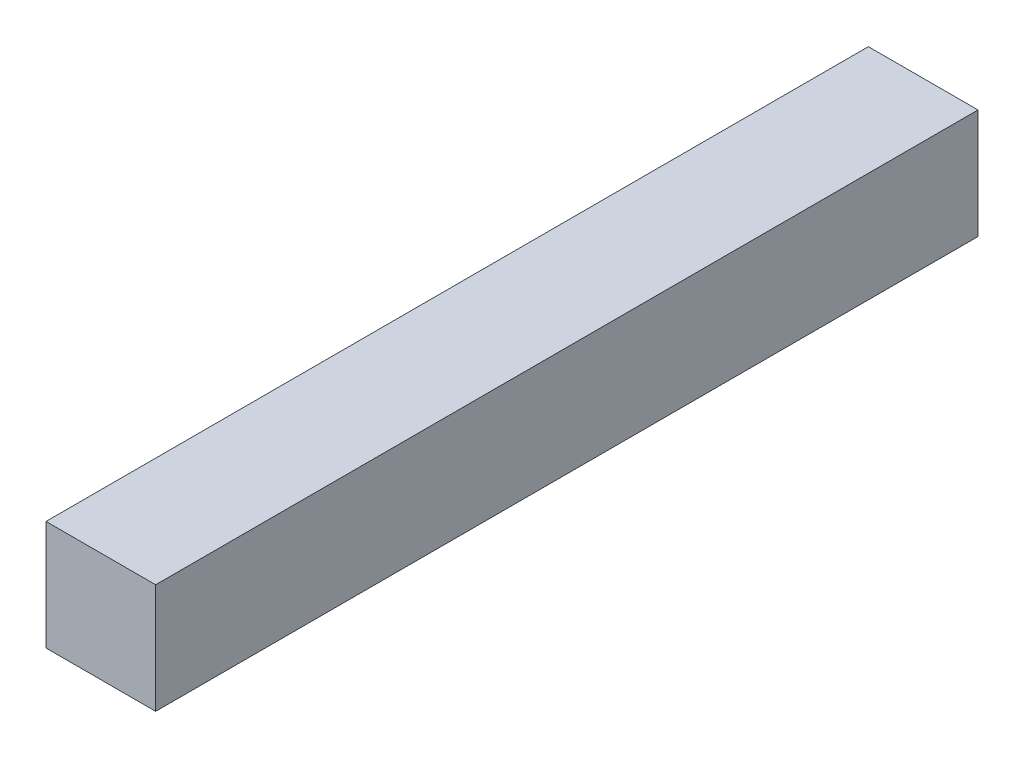
ISO-10303-21;
HEADER;
FILE_DESCRIPTION(('STEP AP214'),'2;1');
FILE_NAME('part.step','',(''),(''),'','','');
FILE_SCHEMA(('AUTOMOTIVE_DESIGN { 1 0 10303 214 1 1 1 1 }'));
ENDSEC;
DATA;
#1=APPLICATION_CONTEXT('core data for automotive mechanical design processes');
#2=APPLICATION_PROTOCOL_DEFINITION('international standard','automotive_design',2000,#1);
#3=PRODUCT_CONTEXT('',#1,'mechanical');
#4=PRODUCT('Part','Part','',(#3));
#5=PRODUCT_RELATED_PRODUCT_CATEGORY('part','',(#4));
#6=PRODUCT_DEFINITION_FORMATION('','',#4);
#7=PRODUCT_DEFINITION_CONTEXT('part definition',#1,'design');
#8=PRODUCT_DEFINITION('design','',#6,#7);
#9=PRODUCT_DEFINITION_SHAPE('','',#8);
#10=(LENGTH_UNIT() NAMED_UNIT(*) SI_UNIT(.MILLI.,.METRE.));
#11=(NAMED_UNIT(*) PLANE_ANGLE_UNIT() SI_UNIT($,.RADIAN.));
#12=(NAMED_UNIT(*) SI_UNIT($,.STERADIAN.) SOLID_ANGLE_UNIT());
#13=UNCERTAINTY_MEASURE_WITH_UNIT(LENGTH_MEASURE(1.E-05),#10,'distance_accuracy_value','');
#14=(GEOMETRIC_REPRESENTATION_CONTEXT(3) GLOBAL_UNCERTAINTY_ASSIGNED_CONTEXT((#13)) GLOBAL_UNIT_ASSIGNED_CONTEXT((#10,
#11,#12)) REPRESENTATION_CONTEXT('',''));
#15=CARTESIAN_POINT('',(0.,0.,0.));
#16=DIRECTION('',(0.,0.,1.));
#17=DIRECTION('',(1.,0.,0.));
#18=AXIS2_PLACEMENT_3D('',#15,#16,#17);
#19=CARTESIAN_POINT('',(25.,-25.,375.));
#20=DIRECTION('',(-1.,0.,0.));
#21=DIRECTION('',(0.,0.,1.));
#22=AXIS2_PLACEMENT_3D('',#19,#20,#21);
#23=PLANE('',#22);
#24=DIRECTION('',(0.,1.,0.));
#25=VECTOR('',#24,1.);
#26=CARTESIAN_POINT('',(25.,-25.,0.));
#27=LINE('',#26,#25);
#28=CARTESIAN_POINT('',(25.,-25.,0.));
#29=VERTEX_POINT('',#28);
#30=CARTESIAN_POINT('',(25.,25.,0.));
#31=VERTEX_POINT('',#30);
#32=EDGE_CURVE('E105',#29,#31,#27,.T.);
#33=ORIENTED_EDGE('',*,*,#32,.T.);
#34=DIRECTION('',(0.,0.,-1.));
#35=VECTOR('',#34,1.);
#36=CARTESIAN_POINT('',(25.,25.,375.));
#37=LINE('',#36,#35);
#38=CARTESIAN_POINT('',(25.,25.,375.));
#39=VERTEX_POINT('',#38);
#40=EDGE_CURVE('E11',#39,#31,#37,.T.);
#41=ORIENTED_EDGE('',*,*,#40,.F.);
#42=DIRECTION('',(0.,1.,0.));
#43=VECTOR('',#42,1.);
#44=CARTESIAN_POINT('',(25.,-25.,375.));
#45=LINE('',#44,#43);
#46=CARTESIAN_POINT('',(25.,-25.,375.));
#47=VERTEX_POINT('',#46);
#48=EDGE_CURVE('E89',#47,#39,#45,.T.);
#49=ORIENTED_EDGE('',*,*,#48,.F.);
#50=DIRECTION('',(0.,0.,-1.));
#51=VECTOR('',#50,1.);
#52=CARTESIAN_POINT('',(25.,-25.,375.));
#53=LINE('',#52,#51);
#54=EDGE_CURVE('E98',#47,#29,#53,.T.);
#55=ORIENTED_EDGE('',*,*,#54,.T.);
#56=EDGE_LOOP('',(#33,#41,#49,#55));
#57=FACE_BOUND('',#56,.T.);
#58=ADVANCED_FACE('F39',(#57),#23,.F.);
#59=CARTESIAN_POINT('',(-25.,25.,375.));
#60=DIRECTION('',(0.,-1.,0.));
#61=DIRECTION('',(0.,0.,-1.));
#62=AXIS2_PLACEMENT_3D('',#59,#60,#61);
#63=PLANE('',#62);
#64=DIRECTION('',(-1.,0.,0.));
#65=VECTOR('',#64,1.);
#66=CARTESIAN_POINT('',(-25.,25.,0.));
#67=LINE('',#66,#65);
#68=CARTESIAN_POINT('',(-25.,25.,0.));
#69=VERTEX_POINT('',#68);
#70=EDGE_CURVE('E94',#31,#69,#67,.T.);
#71=ORIENTED_EDGE('',*,*,#70,.T.);
#72=DIRECTION('',(0.,0.,-1.));
#73=VECTOR('',#72,1.);
#74=CARTESIAN_POINT('',(-25.,25.,375.));
#75=LINE('',#74,#73);
#76=CARTESIAN_POINT('',(-25.,25.,375.));
#77=VERTEX_POINT('',#76);
#78=EDGE_CURVE('E50',#77,#69,#75,.T.);
#79=ORIENTED_EDGE('',*,*,#78,.F.);
#80=DIRECTION('',(-1.,0.,0.));
#81=VECTOR('',#80,1.);
#82=CARTESIAN_POINT('',(-25.,25.,375.));
#83=LINE('',#82,#81);
#84=EDGE_CURVE('E83',#39,#77,#83,.T.);
#85=ORIENTED_EDGE('',*,*,#84,.F.);
#86=ORIENTED_EDGE('',*,*,#40,.T.);
#87=EDGE_LOOP('',(#71,#79,#85,#86));
#88=FACE_BOUND('',#87,.T.);
#89=ADVANCED_FACE('F91',(#88),#63,.F.);
#90=CARTESIAN_POINT('',(-25.,-25.,375.));
#91=DIRECTION('',(1.,0.,0.));
#92=DIRECTION('',(0.,0.,-1.));
#93=AXIS2_PLACEMENT_3D('',#90,#91,#92);
#94=PLANE('',#93);
#95=DIRECTION('',(0.,-1.,0.));
#96=VECTOR('',#95,1.);
#97=CARTESIAN_POINT('',(-25.,-25.,0.));
#98=LINE('',#97,#96);
#99=CARTESIAN_POINT('',(-25.,-25.,0.));
#100=VERTEX_POINT('',#99);
#101=EDGE_CURVE('E75',#69,#100,#98,.T.);
#102=ORIENTED_EDGE('',*,*,#101,.T.);
#103=DIRECTION('',(0.,0.,-1.));
#104=VECTOR('',#103,1.);
#105=CARTESIAN_POINT('',(-25.,-25.,375.));
#106=LINE('',#105,#104);
#107=CARTESIAN_POINT('',(-25.,-25.,375.));
#108=VERTEX_POINT('',#107);
#109=EDGE_CURVE('E92',#108,#100,#106,.T.);
#110=ORIENTED_EDGE('',*,*,#109,.F.);
#111=DIRECTION('',(0.,-1.,0.));
#112=VECTOR('',#111,1.);
#113=CARTESIAN_POINT('',(-25.,-25.,375.));
#114=LINE('',#113,#112);
#115=EDGE_CURVE('E86',#77,#108,#114,.T.);
#116=ORIENTED_EDGE('',*,*,#115,.F.);
#117=ORIENTED_EDGE('',*,*,#78,.T.);
#118=EDGE_LOOP('',(#102,#110,#116,#117));
#119=FACE_BOUND('',#118,.T.);
#120=ADVANCED_FACE('F96',(#119),#94,.F.);
#121=CARTESIAN_POINT('',(-25.,-25.,375.));
#122=DIRECTION('',(0.,1.,0.));
#123=DIRECTION('',(0.,0.,1.));
#124=AXIS2_PLACEMENT_3D('',#121,#122,#123);
#125=PLANE('',#124);
#126=DIRECTION('',(1.,0.,0.));
#127=VECTOR('',#126,1.);
#128=CARTESIAN_POINT('',(-25.,-25.,0.));
#129=LINE('',#128,#127);
#130=EDGE_CURVE('E77',#100,#29,#129,.T.);
#131=ORIENTED_EDGE('',*,*,#130,.T.);
#132=ORIENTED_EDGE('',*,*,#54,.F.);
#133=DIRECTION('',(1.,0.,0.));
#134=VECTOR('',#133,1.);
#135=CARTESIAN_POINT('',(-25.,-25.,375.));
#136=LINE('',#135,#134);
#137=EDGE_CURVE('E54',#108,#47,#136,.T.);
#138=ORIENTED_EDGE('',*,*,#137,.F.);
#139=ORIENTED_EDGE('',*,*,#109,.T.);
#140=EDGE_LOOP('',(#131,#132,#138,#139));
#141=FACE_BOUND('',#140,.T.);
#142=ADVANCED_FACE('F108',(#141),#125,.F.);
#143=CARTESIAN_POINT('',(0.,0.,375.));
#144=DIRECTION('',(0.,0.,-1.));
#145=DIRECTION('',(-1.,0.,0.));
#146=AXIS2_PLACEMENT_3D('',#143,#144,#145);
#147=PLANE('',#146);
#148=ORIENTED_EDGE('',*,*,#48,.T.);
#149=ORIENTED_EDGE('',*,*,#84,.T.);
#150=ORIENTED_EDGE('',*,*,#115,.T.);
#151=ORIENTED_EDGE('',*,*,#137,.T.);
#152=EDGE_LOOP('',(#148,#149,#150,#151));
#153=FACE_BOUND('',#152,.T.);
#154=ADVANCED_FACE('F88',(#153),#147,.F.);
#155=CARTESIAN_POINT('',(0.,0.,0.));
#156=DIRECTION('',(0.,0.,-1.));
#157=DIRECTION('',(-1.,0.,0.));
#158=AXIS2_PLACEMENT_3D('',#155,#156,#157);
#159=PLANE('',#158);
#160=ORIENTED_EDGE('',*,*,#32,.F.);
#161=ORIENTED_EDGE('',*,*,#130,.F.);
#162=ORIENTED_EDGE('',*,*,#101,.F.);
#163=ORIENTED_EDGE('',*,*,#70,.F.);
#164=EDGE_LOOP('',(#160,#161,#162,#163));
#165=FACE_BOUND('',#164,.T.);
#166=ADVANCED_FACE('F115',(#165),#159,.T.);
#167=CLOSED_SHELL('',(#58,#89,#120,#142,#154,#166));
#168=MANIFOLD_SOLID_BREP('B2',#167);
#169=ADVANCED_BREP_SHAPE_REPRESENTATION('',(#18,#168),#14);
#170=SHAPE_DEFINITION_REPRESENTATION(#9,#169);
ENDSEC;
END-ISO-10303-21;
